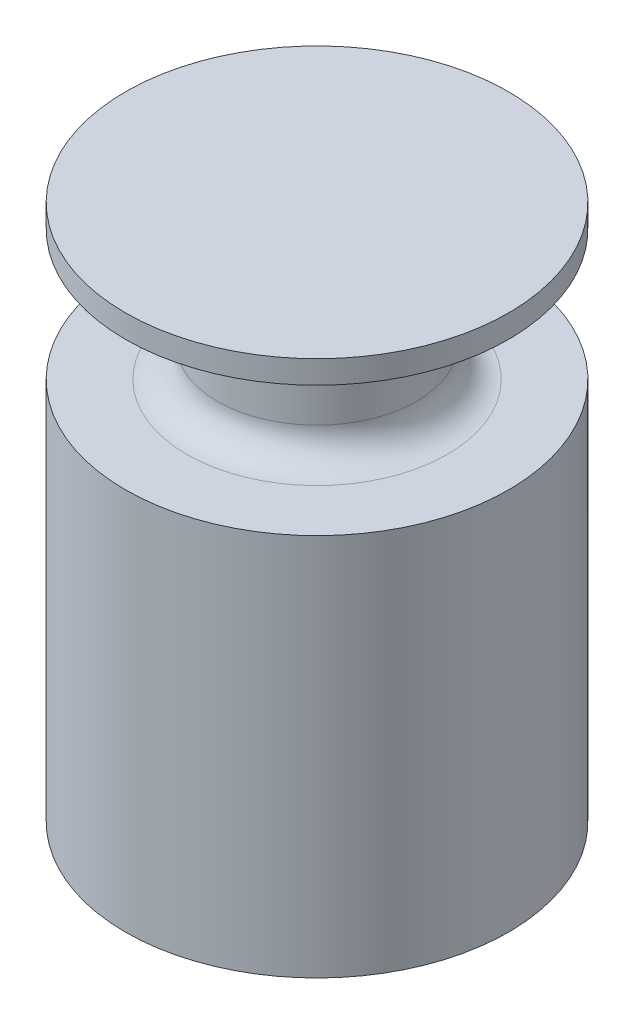
ISO-10303-21;
HEADER;
FILE_DESCRIPTION(('STEP AP214'),'2;1');
FILE_NAME('part.step','',(''),(''),'','','');
FILE_SCHEMA(('AUTOMOTIVE_DESIGN { 1 0 10303 214 1 1 1 1 }'));
ENDSEC;
DATA;
#1=APPLICATION_CONTEXT('core data for automotive mechanical design processes');
#2=APPLICATION_PROTOCOL_DEFINITION('international standard','automotive_design',2000,#1);
#3=PRODUCT_CONTEXT('',#1,'mechanical');
#4=PRODUCT('Part','Part','',(#3));
#5=PRODUCT_RELATED_PRODUCT_CATEGORY('part','',(#4));
#6=PRODUCT_DEFINITION_FORMATION('','',#4);
#7=PRODUCT_DEFINITION_CONTEXT('part definition',#1,'design');
#8=PRODUCT_DEFINITION('design','',#6,#7);
#9=PRODUCT_DEFINITION_SHAPE('','',#8);
#10=(LENGTH_UNIT() NAMED_UNIT(*) SI_UNIT(.MILLI.,.METRE.));
#11=(NAMED_UNIT(*) PLANE_ANGLE_UNIT() SI_UNIT($,.RADIAN.));
#12=(NAMED_UNIT(*) SI_UNIT($,.STERADIAN.) SOLID_ANGLE_UNIT());
#13=UNCERTAINTY_MEASURE_WITH_UNIT(LENGTH_MEASURE(1.E-05),#10,'distance_accuracy_value','');
#14=(GEOMETRIC_REPRESENTATION_CONTEXT(3) GLOBAL_UNCERTAINTY_ASSIGNED_CONTEXT((#13)) GLOBAL_UNIT_ASSIGNED_CONTEXT((#10,
#11,#12)) REPRESENTATION_CONTEXT('',''));
#15=CARTESIAN_POINT('',(0.,0.,0.));
#16=DIRECTION('',(0.,0.,1.));
#17=DIRECTION('',(1.,0.,0.));
#18=AXIS2_PLACEMENT_3D('',#15,#16,#17);
#19=CARTESIAN_POINT('',(0.,70.,0.));
#20=DIRECTION('',(0.,-1.,0.));
#21=DIRECTION('',(0.,0.,-1.));
#22=AXIS2_PLACEMENT_3D('',#19,#20,#21);
#23=CYLINDRICAL_SURFACE('',#22,25.);
#24=CARTESIAN_POINT('',(0.,0.,0.));
#25=DIRECTION('',(0.,1.,0.));
#26=DIRECTION('',(0.,0.,1.));
#27=AXIS2_PLACEMENT_3D('',#24,#25,#26);
#28=CIRCLE('',#27,25.);
#29=CARTESIAN_POINT('',(0.,0.,25.));
#30=VERTEX_POINT('',#29);
#31=EDGE_CURVE('E61',#30,#30,#28,.T.);
#32=ORIENTED_EDGE('',*,*,#31,.T.);
#33=EDGE_LOOP('',(#32));
#34=FACE_BOUND('',#33,.T.);
#35=CARTESIAN_POINT('',(0.,50.,0.));
#36=DIRECTION('',(0.,1.,0.));
#37=DIRECTION('',(0.,0.,1.));
#38=AXIS2_PLACEMENT_3D('',#35,#36,#37);
#39=CIRCLE('',#38,25.);
#40=CARTESIAN_POINT('',(0.,50.,25.));
#41=VERTEX_POINT('',#40);
#42=EDGE_CURVE('E58',#41,#41,#39,.T.);
#43=ORIENTED_EDGE('',*,*,#42,.F.);
#44=EDGE_LOOP('',(#43));
#45=FACE_BOUND('',#44,.T.);
#46=ADVANCED_FACE('F37',(#34,#45),#23,.T.);
#47=CARTESIAN_POINT('',(0.,0.,0.));
#48=DIRECTION('',(0.,1.,0.));
#49=DIRECTION('',(0.,0.,1.));
#50=AXIS2_PLACEMENT_3D('',#47,#48,#49);
#51=PLANE('',#50);
#52=ORIENTED_EDGE('',*,*,#31,.F.);
#53=EDGE_LOOP('',(#52));
#54=FACE_BOUND('',#53,.T.);
#55=ADVANCED_FACE('F86',(#54),#51,.F.);
#56=CARTESIAN_POINT('',(0.,50.,0.));
#57=DIRECTION('',(0.,1.,0.));
#58=DIRECTION('',(0.,0.,1.));
#59=AXIS2_PLACEMENT_3D('',#56,#57,#58);
#60=PLANE('',#59);
#61=CARTESIAN_POINT('',(0.,50.,0.));
#62=DIRECTION('',(0.,1.,0.));
#63=DIRECTION('',(0.,0.,1.));
#64=AXIS2_PLACEMENT_3D('',#61,#62,#63);
#65=CIRCLE('',#64,17.);
#66=CARTESIAN_POINT('',(0.,50.,17.));
#67=VERTEX_POINT('',#66);
#68=EDGE_CURVE('E44',#67,#67,#65,.F.);
#69=ORIENTED_EDGE('',*,*,#68,.T.);
#70=EDGE_LOOP('',(#69));
#71=FACE_BOUND('',#70,.T.);
#72=ORIENTED_EDGE('',*,*,#42,.T.);
#73=EDGE_LOOP('',(#72));
#74=FACE_BOUND('',#73,.T.);
#75=ADVANCED_FACE('F91',(#71,#74),#60,.T.);
#76=CARTESIAN_POINT('',(0.,67.,0.));
#77=DIRECTION('',(0.,1.,0.));
#78=DIRECTION('',(0.,0.,1.));
#79=AXIS2_PLACEMENT_3D('',#76,#77,#78);
#80=PLANE('',#79);
#81=CARTESIAN_POINT('',(0.,67.,0.));
#82=DIRECTION('',(0.,1.,0.));
#83=DIRECTION('',(0.,0.,1.));
#84=AXIS2_PLACEMENT_3D('',#81,#82,#83);
#85=CIRCLE('',#84,17.);
#86=CARTESIAN_POINT('',(0.,67.,17.));
#87=VERTEX_POINT('',#86);
#88=EDGE_CURVE('E11',#87,#87,#85,.T.);
#89=ORIENTED_EDGE('',*,*,#88,.T.);
#90=EDGE_LOOP('',(#89));
#91=FACE_BOUND('',#90,.T.);
#92=CARTESIAN_POINT('',(0.,67.,0.));
#93=DIRECTION('',(0.,1.,0.));
#94=DIRECTION('',(0.,0.,1.));
#95=AXIS2_PLACEMENT_3D('',#92,#93,#94);
#96=CIRCLE('',#95,25.);
#97=CARTESIAN_POINT('',(0.,67.,25.));
#98=VERTEX_POINT('',#97);
#99=EDGE_CURVE('E62',#98,#98,#96,.T.);
#100=ORIENTED_EDGE('',*,*,#99,.F.);
#101=EDGE_LOOP('',(#100));
#102=FACE_BOUND('',#101,.T.);
#103=ADVANCED_FACE('F98',(#91,#102),#80,.F.);
#104=CARTESIAN_POINT('',(0.,50.,0.));
#105=DIRECTION('',(0.,1.,0.));
#106=DIRECTION('',(0.,0.,1.));
#107=AXIS2_PLACEMENT_3D('',#104,#105,#106);
#108=CYLINDRICAL_SURFACE('',#107,13.);
#109=CARTESIAN_POINT('',(0.,54.,0.));
#110=DIRECTION('',(0.,1.,0.));
#111=DIRECTION('',(0.,0.,1.));
#112=AXIS2_PLACEMENT_3D('',#109,#110,#111);
#113=CIRCLE('',#112,13.);
#114=CARTESIAN_POINT('',(0.,54.,13.));
#115=VERTEX_POINT('',#114);
#116=EDGE_CURVE('E48',#115,#115,#113,.T.);
#117=ORIENTED_EDGE('',*,*,#116,.T.);
#118=EDGE_LOOP('',(#117));
#119=FACE_BOUND('',#118,.T.);
#120=CARTESIAN_POINT('',(0.,63.,0.));
#121=DIRECTION('',(0.,1.,0.));
#122=DIRECTION('',(0.,0.,1.));
#123=AXIS2_PLACEMENT_3D('',#120,#121,#122);
#124=CIRCLE('',#123,13.);
#125=CARTESIAN_POINT('',(0.,63.,13.));
#126=VERTEX_POINT('',#125);
#127=EDGE_CURVE('E52',#126,#126,#124,.F.);
#128=ORIENTED_EDGE('',*,*,#127,.T.);
#129=EDGE_LOOP('',(#128));
#130=FACE_BOUND('',#129,.T.);
#131=ADVANCED_FACE('F82',(#119,#130),#108,.T.);
#132=CARTESIAN_POINT('',(0.,70.,0.));
#133=DIRECTION('',(0.,1.,0.));
#134=DIRECTION('',(0.,0.,1.));
#135=AXIS2_PLACEMENT_3D('',#132,#133,#134);
#136=PLANE('',#135);
#137=CARTESIAN_POINT('',(0.,70.,0.));
#138=DIRECTION('',(0.,1.,0.));
#139=DIRECTION('',(0.,0.,1.));
#140=AXIS2_PLACEMENT_3D('',#137,#138,#139);
#141=CIRCLE('',#140,25.);
#142=CARTESIAN_POINT('',(0.,70.,25.));
#143=VERTEX_POINT('',#142);
#144=EDGE_CURVE('E57',#143,#143,#141,.T.);
#145=ORIENTED_EDGE('',*,*,#144,.T.);
#146=EDGE_LOOP('',(#145));
#147=FACE_BOUND('',#146,.T.);
#148=ADVANCED_FACE('F70',(#147),#136,.T.);
#149=ORIENTED_EDGE('',*,*,#99,.T.);
#150=EDGE_LOOP('',(#149));
#151=FACE_BOUND('',#150,.T.);
#152=ORIENTED_EDGE('',*,*,#144,.F.);
#153=EDGE_LOOP('',(#152));
#154=FACE_BOUND('',#153,.T.);
#155=ADVANCED_FACE('F72',(#151,#154),#23,.T.);
#156=CARTESIAN_POINT('',(0.,54.,0.));
#157=DIRECTION('',(0.,1.,0.));
#158=DIRECTION('',(0.,0.,1.));
#159=AXIS2_PLACEMENT_3D('',#156,#157,#158);
#160=TOROIDAL_SURFACE('',#159,17.,4.);
#161=ORIENTED_EDGE('',*,*,#68,.F.);
#162=EDGE_LOOP('',(#161));
#163=FACE_BOUND('',#162,.T.);
#164=ORIENTED_EDGE('',*,*,#116,.F.);
#165=EDGE_LOOP('',(#164));
#166=FACE_BOUND('',#165,.T.);
#167=ADVANCED_FACE('F74',(#163,#166),#160,.F.);
#168=CARTESIAN_POINT('',(0.,63.,0.));
#169=DIRECTION('',(0.,1.,0.));
#170=DIRECTION('',(0.,0.,1.));
#171=AXIS2_PLACEMENT_3D('',#168,#169,#170);
#172=TOROIDAL_SURFACE('',#171,17.,4.);
#173=ORIENTED_EDGE('',*,*,#127,.F.);
#174=EDGE_LOOP('',(#173));
#175=FACE_BOUND('',#174,.T.);
#176=ORIENTED_EDGE('',*,*,#88,.F.);
#177=EDGE_LOOP('',(#176));
#178=FACE_BOUND('',#177,.T.);
#179=ADVANCED_FACE('F39',(#175,#178),#172,.F.);
#180=CLOSED_SHELL('',(#46,#55,#75,#103,#131,#148,#155,#167,#179));
#181=MANIFOLD_SOLID_BREP('B2',#180);
#182=ADVANCED_BREP_SHAPE_REPRESENTATION('',(#18,#181),#14);
#183=SHAPE_DEFINITION_REPRESENTATION(#9,#182);
ENDSEC;
END-ISO-10303-21;
